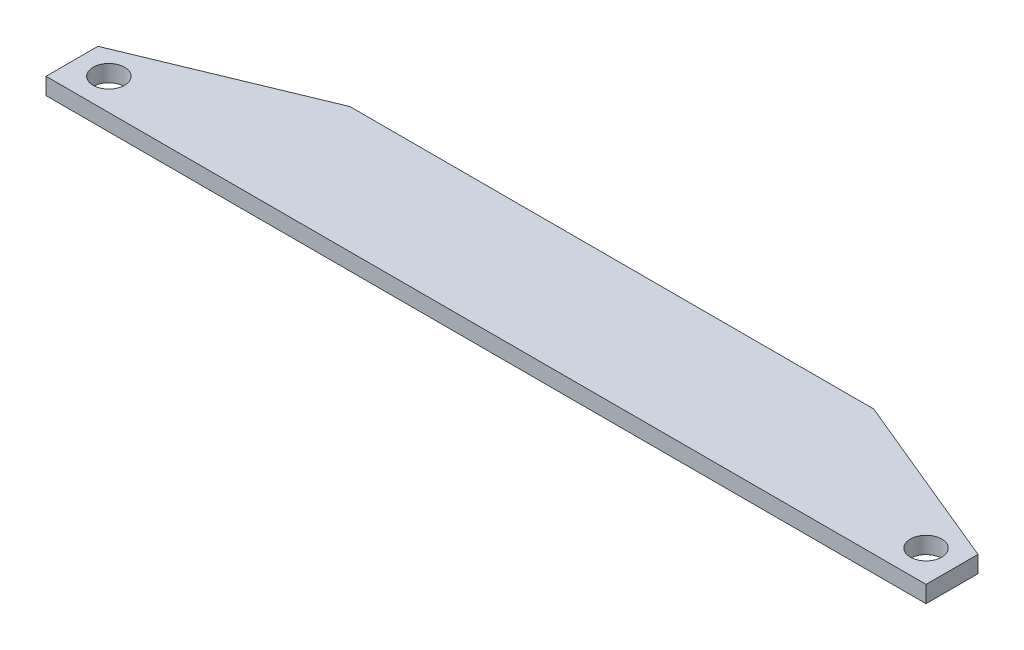
ISO-10303-21;
HEADER;
FILE_DESCRIPTION(('STEP AP214'),'2;1');
FILE_NAME('part.step','',(''),(''),'','','');
FILE_SCHEMA(('AUTOMOTIVE_DESIGN { 1 0 10303 214 1 1 1 1 }'));
ENDSEC;
DATA;
#1=APPLICATION_CONTEXT('core data for automotive mechanical design processes');
#2=APPLICATION_PROTOCOL_DEFINITION('international standard','automotive_design',2000,#1);
#3=PRODUCT_CONTEXT('',#1,'mechanical');
#4=PRODUCT('Part','Part','',(#3));
#5=PRODUCT_RELATED_PRODUCT_CATEGORY('part','',(#4));
#6=PRODUCT_DEFINITION_FORMATION('','',#4);
#7=PRODUCT_DEFINITION_CONTEXT('part definition',#1,'design');
#8=PRODUCT_DEFINITION('design','',#6,#7);
#9=PRODUCT_DEFINITION_SHAPE('','',#8);
#10=(LENGTH_UNIT() NAMED_UNIT(*) SI_UNIT(.MILLI.,.METRE.));
#11=(NAMED_UNIT(*) PLANE_ANGLE_UNIT() SI_UNIT($,.RADIAN.));
#12=(NAMED_UNIT(*) SI_UNIT($,.STERADIAN.) SOLID_ANGLE_UNIT());
#13=UNCERTAINTY_MEASURE_WITH_UNIT(LENGTH_MEASURE(1.E-05),#10,'distance_accuracy_value','');
#14=(GEOMETRIC_REPRESENTATION_CONTEXT(3) GLOBAL_UNCERTAINTY_ASSIGNED_CONTEXT((#13)) GLOBAL_UNIT_ASSIGNED_CONTEXT((#10,
#11,#12)) REPRESENTATION_CONTEXT('',''));
#15=CARTESIAN_POINT('',(0.,0.,0.));
#16=DIRECTION('',(0.,0.,1.));
#17=DIRECTION('',(1.,0.,0.));
#18=AXIS2_PLACEMENT_3D('',#15,#16,#17);
#19=CARTESIAN_POINT('',(42.,1.6,0.));
#20=DIRECTION('',(-1.,0.,0.));
#21=DIRECTION('',(0.,0.,1.));
#22=AXIS2_PLACEMENT_3D('',#19,#20,#21);
#23=PLANE('',#22);
#24=DIRECTION('',(0.,0.,-1.));
#25=VECTOR('',#24,1.);
#26=CARTESIAN_POINT('',(42.,0.,0.));
#27=LINE('',#26,#25);
#28=CARTESIAN_POINT('',(42.,0.,0.));
#29=VERTEX_POINT('',#28);
#30=CARTESIAN_POINT('',(42.,0.,-4.95836943965751));
#31=VERTEX_POINT('',#30);
#32=EDGE_CURVE('E134',#29,#31,#27,.T.);
#33=ORIENTED_EDGE('',*,*,#32,.T.);
#34=DIRECTION('',(0.,-1.,0.));
#35=VECTOR('',#34,1.);
#36=CARTESIAN_POINT('',(42.,1.6,-4.95836943965751));
#37=LINE('',#36,#35);
#38=CARTESIAN_POINT('',(42.,1.6,-4.95836943965751));
#39=VERTEX_POINT('',#38);
#40=EDGE_CURVE('E11',#39,#31,#37,.T.);
#41=ORIENTED_EDGE('',*,*,#40,.F.);
#42=DIRECTION('',(0.,0.,-1.));
#43=VECTOR('',#42,1.);
#44=CARTESIAN_POINT('',(42.,1.6,0.));
#45=LINE('',#44,#43);
#46=CARTESIAN_POINT('',(42.,1.6,0.));
#47=VERTEX_POINT('',#46);
#48=EDGE_CURVE('E151',#47,#39,#45,.T.);
#49=ORIENTED_EDGE('',*,*,#48,.F.);
#50=DIRECTION('',(0.,-1.,0.));
#51=VECTOR('',#50,1.);
#52=CARTESIAN_POINT('',(42.,1.6,0.));
#53=LINE('',#52,#51);
#54=EDGE_CURVE('E130',#47,#29,#53,.T.);
#55=ORIENTED_EDGE('',*,*,#54,.T.);
#56=EDGE_LOOP('',(#33,#41,#49,#55));
#57=FACE_BOUND('',#56,.T.);
#58=ADVANCED_FACE('F45',(#57),#23,.F.);
#59=CARTESIAN_POINT('',(42.,1.6,-4.95836943965751));
#60=DIRECTION('',(-0.382683432365084,0.,0.923879532511289));
#61=DIRECTION('',(0.923879532511289,0.,0.382683432365084));
#62=AXIS2_PLACEMENT_3D('',#59,#60,#61);
#63=PLANE('',#62);
#64=DIRECTION('',(-0.923879532511289,0.,-0.382683432365084));
#65=VECTOR('',#64,1.);
#66=CARTESIAN_POINT('',(42.,0.,-4.95836943965751));
#67=LINE('',#66,#65);
#68=CARTESIAN_POINT('',(25.,0.,-12.));
#69=VERTEX_POINT('',#68);
#70=EDGE_CURVE('E138',#31,#69,#67,.T.);
#71=ORIENTED_EDGE('',*,*,#70,.T.);
#72=DIRECTION('',(0.,-1.,0.));
#73=VECTOR('',#72,1.);
#74=CARTESIAN_POINT('',(25.,1.6,-12.));
#75=LINE('',#74,#73);
#76=CARTESIAN_POINT('',(25.,1.6,-12.));
#77=VERTEX_POINT('',#76);
#78=EDGE_CURVE('E54',#77,#69,#75,.T.);
#79=ORIENTED_EDGE('',*,*,#78,.F.);
#80=DIRECTION('',(-0.923879532511289,0.,-0.382683432365084));
#81=VECTOR('',#80,1.);
#82=CARTESIAN_POINT('',(42.,1.6,-4.95836943965751));
#83=LINE('',#82,#81);
#84=EDGE_CURVE('E99',#39,#77,#83,.T.);
#85=ORIENTED_EDGE('',*,*,#84,.F.);
#86=ORIENTED_EDGE('',*,*,#40,.T.);
#87=EDGE_LOOP('',(#71,#79,#85,#86));
#88=FACE_BOUND('',#87,.T.);
#89=ADVANCED_FACE('F180',(#88),#63,.F.);
#90=CARTESIAN_POINT('',(25.,1.6,-12.));
#91=DIRECTION('',(0.,0.,1.));
#92=DIRECTION('',(1.,0.,0.));
#93=AXIS2_PLACEMENT_3D('',#90,#91,#92);
#94=PLANE('',#93);
#95=DIRECTION('',(-1.,0.,0.));
#96=VECTOR('',#95,1.);
#97=CARTESIAN_POINT('',(25.,0.,-12.));
#98=LINE('',#97,#96);
#99=CARTESIAN_POINT('',(-25.,0.,-12.));
#100=VERTEX_POINT('',#99);
#101=EDGE_CURVE('E142',#69,#100,#98,.T.);
#102=ORIENTED_EDGE('',*,*,#101,.T.);
#103=DIRECTION('',(0.,-1.,0.));
#104=VECTOR('',#103,1.);
#105=CARTESIAN_POINT('',(-25.,1.6,-12.));
#106=LINE('',#105,#104);
#107=CARTESIAN_POINT('',(-25.,1.6,-12.));
#108=VERTEX_POINT('',#107);
#109=EDGE_CURVE('E123',#108,#100,#106,.T.);
#110=ORIENTED_EDGE('',*,*,#109,.F.);
#111=DIRECTION('',(-1.,0.,0.));
#112=VECTOR('',#111,1.);
#113=CARTESIAN_POINT('',(25.,1.6,-12.));
#114=LINE('',#113,#112);
#115=EDGE_CURVE('E112',#77,#108,#114,.T.);
#116=ORIENTED_EDGE('',*,*,#115,.F.);
#117=ORIENTED_EDGE('',*,*,#78,.T.);
#118=EDGE_LOOP('',(#102,#110,#116,#117));
#119=FACE_BOUND('',#118,.T.);
#120=ADVANCED_FACE('F161',(#119),#94,.F.);
#121=CARTESIAN_POINT('',(-25.,1.6,-12.));
#122=DIRECTION('',(0.382683432365084,0.,0.923879532511289));
#123=DIRECTION('',(0.923879532511289,0.,-0.382683432365084));
#124=AXIS2_PLACEMENT_3D('',#121,#122,#123);
#125=PLANE('',#124);
#126=DIRECTION('',(-0.923879532511289,0.,0.382683432365084));
#127=VECTOR('',#126,1.);
#128=CARTESIAN_POINT('',(-25.,0.,-12.));
#129=LINE('',#128,#127);
#130=CARTESIAN_POINT('',(-42.,0.,-4.95836943965751));
#131=VERTEX_POINT('',#130);
#132=EDGE_CURVE('E121',#100,#131,#129,.T.);
#133=ORIENTED_EDGE('',*,*,#132,.T.);
#134=DIRECTION('',(0.,-1.,0.));
#135=VECTOR('',#134,1.);
#136=CARTESIAN_POINT('',(-42.,1.6,-4.95836943965751));
#137=LINE('',#136,#135);
#138=CARTESIAN_POINT('',(-42.,1.6,-4.95836943965751));
#139=VERTEX_POINT('',#138);
#140=EDGE_CURVE('E118',#139,#131,#137,.T.);
#141=ORIENTED_EDGE('',*,*,#140,.F.);
#142=DIRECTION('',(-0.923879532511289,0.,0.382683432365084));
#143=VECTOR('',#142,1.);
#144=CARTESIAN_POINT('',(-25.,1.6,-12.));
#145=LINE('',#144,#143);
#146=EDGE_CURVE('E106',#108,#139,#145,.T.);
#147=ORIENTED_EDGE('',*,*,#146,.F.);
#148=ORIENTED_EDGE('',*,*,#109,.T.);
#149=EDGE_LOOP('',(#133,#141,#147,#148));
#150=FACE_BOUND('',#149,.T.);
#151=ADVANCED_FACE('F119',(#150),#125,.F.);
#152=CARTESIAN_POINT('',(-42.,1.6,-4.95836943965751));
#153=DIRECTION('',(1.,0.,0.));
#154=DIRECTION('',(0.,0.,-1.));
#155=AXIS2_PLACEMENT_3D('',#152,#153,#154);
#156=PLANE('',#155);
#157=DIRECTION('',(0.,0.,1.));
#158=VECTOR('',#157,1.);
#159=CARTESIAN_POINT('',(-42.,0.,-4.95836943965751));
#160=LINE('',#159,#158);
#161=CARTESIAN_POINT('',(-42.,0.,0.));
#162=VERTEX_POINT('',#161);
#163=EDGE_CURVE('E85',#131,#162,#160,.T.);
#164=ORIENTED_EDGE('',*,*,#163,.T.);
#165=DIRECTION('',(0.,-1.,0.));
#166=VECTOR('',#165,1.);
#167=CARTESIAN_POINT('',(-42.,1.6,0.));
#168=LINE('',#167,#166);
#169=CARTESIAN_POINT('',(-42.,1.6,0.));
#170=VERTEX_POINT('',#169);
#171=EDGE_CURVE('E124',#170,#162,#168,.T.);
#172=ORIENTED_EDGE('',*,*,#171,.F.);
#173=DIRECTION('',(0.,0.,1.));
#174=VECTOR('',#173,1.);
#175=CARTESIAN_POINT('',(-42.,1.6,-4.95836943965751));
#176=LINE('',#175,#174);
#177=EDGE_CURVE('E110',#139,#170,#176,.T.);
#178=ORIENTED_EDGE('',*,*,#177,.F.);
#179=ORIENTED_EDGE('',*,*,#140,.T.);
#180=EDGE_LOOP('',(#164,#172,#178,#179));
#181=FACE_BOUND('',#180,.T.);
#182=ADVANCED_FACE('F126',(#181),#156,.F.);
#183=CARTESIAN_POINT('',(-42.,1.6,0.));
#184=DIRECTION('',(0.,0.,-1.));
#185=DIRECTION('',(-1.,0.,0.));
#186=AXIS2_PLACEMENT_3D('',#183,#184,#185);
#187=PLANE('',#186);
#188=DIRECTION('',(1.,0.,0.));
#189=VECTOR('',#188,1.);
#190=CARTESIAN_POINT('',(-42.,0.,0.));
#191=LINE('',#190,#189);
#192=EDGE_CURVE('E91',#162,#29,#191,.T.);
#193=ORIENTED_EDGE('',*,*,#192,.T.);
#194=ORIENTED_EDGE('',*,*,#54,.F.);
#195=DIRECTION('',(1.,0.,0.));
#196=VECTOR('',#195,1.);
#197=CARTESIAN_POINT('',(-42.,1.6,0.));
#198=LINE('',#197,#196);
#199=EDGE_CURVE('E62',#170,#47,#198,.T.);
#200=ORIENTED_EDGE('',*,*,#199,.F.);
#201=ORIENTED_EDGE('',*,*,#171,.T.);
#202=EDGE_LOOP('',(#193,#194,#200,#201));
#203=FACE_BOUND('',#202,.T.);
#204=ADVANCED_FACE('F168',(#203),#187,.F.);
#205=CARTESIAN_POINT('',(0.,1.6,0.));
#206=DIRECTION('',(0.,1.,0.));
#207=DIRECTION('',(0.,0.,1.));
#208=AXIS2_PLACEMENT_3D('',#205,#206,#207);
#209=PLANE('',#208);
#210=CARTESIAN_POINT('',(-39.,1.6,-3.));
#211=DIRECTION('',(0.,1.,0.));
#212=DIRECTION('',(0.,0.,1.));
#213=AXIS2_PLACEMENT_3D('',#210,#211,#212);
#214=CIRCLE('',#213,1.5);
#215=CARTESIAN_POINT('',(-39.,1.6,-1.5));
#216=VERTEX_POINT('',#215);
#217=EDGE_CURVE('E299',#216,#216,#214,.T.);
#218=ORIENTED_EDGE('',*,*,#217,.F.);
#219=EDGE_LOOP('',(#218));
#220=FACE_BOUND('',#219,.T.);
#221=CARTESIAN_POINT('',(39.,1.6,-3.));
#222=DIRECTION('',(0.,1.,0.));
#223=DIRECTION('',(0.,0.,-1.));
#224=AXIS2_PLACEMENT_3D('',#221,#222,#223);
#225=CIRCLE('',#224,1.5);
#226=CARTESIAN_POINT('',(39.,1.6,-4.5));
#227=VERTEX_POINT('',#226);
#228=EDGE_CURVE('E301',#227,#227,#225,.T.);
#229=ORIENTED_EDGE('',*,*,#228,.F.);
#230=EDGE_LOOP('',(#229));
#231=FACE_BOUND('',#230,.T.);
#232=ORIENTED_EDGE('',*,*,#48,.T.);
#233=ORIENTED_EDGE('',*,*,#84,.T.);
#234=ORIENTED_EDGE('',*,*,#115,.T.);
#235=ORIENTED_EDGE('',*,*,#146,.T.);
#236=ORIENTED_EDGE('',*,*,#177,.T.);
#237=ORIENTED_EDGE('',*,*,#199,.T.);
#238=EDGE_LOOP('',(#232,#233,#234,#235,#236,#237));
#239=FACE_BOUND('',#238,.T.);
#240=ADVANCED_FACE('F108',(#220,#231,#239),#209,.T.);
#241=CARTESIAN_POINT('',(0.,0.,0.));
#242=DIRECTION('',(0.,1.,0.));
#243=DIRECTION('',(0.,0.,1.));
#244=AXIS2_PLACEMENT_3D('',#241,#242,#243);
#245=PLANE('',#244);
#246=CARTESIAN_POINT('',(-39.,0.,-3.));
#247=DIRECTION('',(0.,1.,0.));
#248=DIRECTION('',(0.,0.,1.));
#249=AXIS2_PLACEMENT_3D('',#246,#247,#248);
#250=CIRCLE('',#249,1.5);
#251=CARTESIAN_POINT('',(-39.,0.,-1.5));
#252=VERTEX_POINT('',#251);
#253=EDGE_CURVE('E139',#252,#252,#250,.F.);
#254=ORIENTED_EDGE('',*,*,#253,.F.);
#255=EDGE_LOOP('',(#254));
#256=FACE_BOUND('',#255,.T.);
#257=CARTESIAN_POINT('',(39.,0.,-3.));
#258=DIRECTION('',(0.,1.,0.));
#259=DIRECTION('',(0.,0.,1.));
#260=AXIS2_PLACEMENT_3D('',#257,#258,#259);
#261=CIRCLE('',#260,1.5);
#262=CARTESIAN_POINT('',(39.,0.,-1.5));
#263=VERTEX_POINT('',#262);
#264=EDGE_CURVE('E307',#263,#263,#261,.F.);
#265=ORIENTED_EDGE('',*,*,#264,.F.);
#266=EDGE_LOOP('',(#265));
#267=FACE_BOUND('',#266,.T.);
#268=ORIENTED_EDGE('',*,*,#32,.F.);
#269=ORIENTED_EDGE('',*,*,#192,.F.);
#270=ORIENTED_EDGE('',*,*,#163,.F.);
#271=ORIENTED_EDGE('',*,*,#132,.F.);
#272=ORIENTED_EDGE('',*,*,#101,.F.);
#273=ORIENTED_EDGE('',*,*,#70,.F.);
#274=EDGE_LOOP('',(#268,#269,#270,#271,#272,#273));
#275=FACE_BOUND('',#274,.T.);
#276=ADVANCED_FACE('F164',(#256,#267,#275),#245,.F.);
#277=CARTESIAN_POINT('',(39.,-4.24264068711929,-3.));
#278=DIRECTION('',(0.,1.,0.));
#279=DIRECTION('',(0.,0.,1.));
#280=AXIS2_PLACEMENT_3D('',#277,#278,#279);
#281=CYLINDRICAL_SURFACE('',#280,1.5);
#282=ORIENTED_EDGE('',*,*,#264,.T.);
#283=EDGE_LOOP('',(#282));
#284=FACE_BOUND('',#283,.T.);
#285=ORIENTED_EDGE('',*,*,#228,.T.);
#286=EDGE_LOOP('',(#285));
#287=FACE_BOUND('',#286,.T.);
#288=ADVANCED_FACE('F217',(#284,#287),#281,.F.);
#289=CARTESIAN_POINT('',(-39.,-4.24264068711929,-3.));
#290=DIRECTION('',(0.,1.,0.));
#291=DIRECTION('',(0.,0.,1.));
#292=AXIS2_PLACEMENT_3D('',#289,#290,#291);
#293=CYLINDRICAL_SURFACE('',#292,1.5);
#294=ORIENTED_EDGE('',*,*,#253,.T.);
#295=EDGE_LOOP('',(#294));
#296=FACE_BOUND('',#295,.T.);
#297=ORIENTED_EDGE('',*,*,#217,.T.);
#298=EDGE_LOOP('',(#297));
#299=FACE_BOUND('',#298,.T.);
#300=ADVANCED_FACE('F226',(#296,#299),#293,.F.);
#301=CLOSED_SHELL('',(#58,#89,#120,#151,#182,#204,#240,#276,#288,#300));
#302=MANIFOLD_SOLID_BREP('B2',#301);
#303=ADVANCED_BREP_SHAPE_REPRESENTATION('',(#18,#302),#14);
#304=SHAPE_DEFINITION_REPRESENTATION(#9,#303);
ENDSEC;
END-ISO-10303-21;
